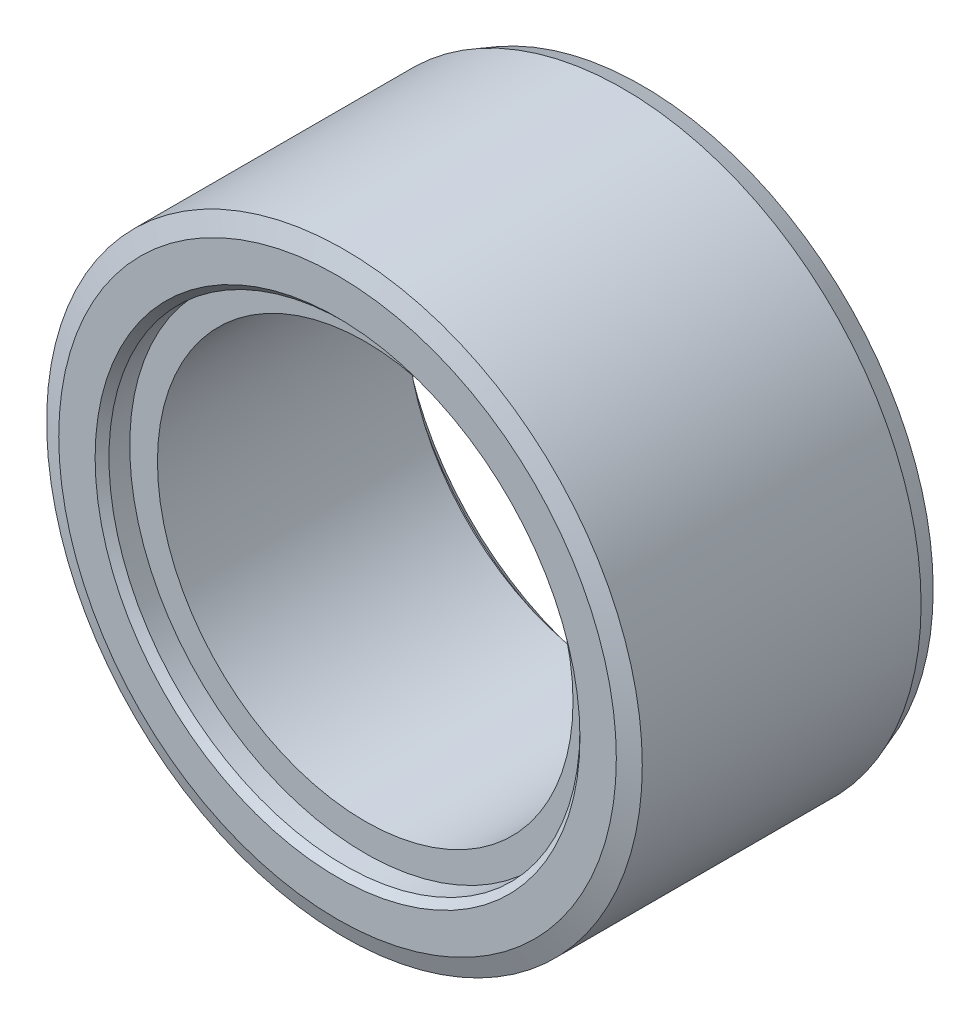
ISO-10303-21;
HEADER;
FILE_DESCRIPTION(('STEP AP214'),'2;1');
FILE_NAME('part.step','',(''),(''),'','','');
FILE_SCHEMA(('AUTOMOTIVE_DESIGN { 1 0 10303 214 1 1 1 1 }'));
ENDSEC;
DATA;
#1=APPLICATION_CONTEXT('core data for automotive mechanical design processes');
#2=APPLICATION_PROTOCOL_DEFINITION('international standard','automotive_design',2000,#1);
#3=PRODUCT_CONTEXT('',#1,'mechanical');
#4=PRODUCT('Part','Part','',(#3));
#5=PRODUCT_RELATED_PRODUCT_CATEGORY('part','',(#4));
#6=PRODUCT_DEFINITION_FORMATION('','',#4);
#7=PRODUCT_DEFINITION_CONTEXT('part definition',#1,'design');
#8=PRODUCT_DEFINITION('design','',#6,#7);
#9=PRODUCT_DEFINITION_SHAPE('','',#8);
#10=(LENGTH_UNIT() NAMED_UNIT(*) SI_UNIT(.MILLI.,.METRE.));
#11=(NAMED_UNIT(*) PLANE_ANGLE_UNIT() SI_UNIT($,.RADIAN.));
#12=(NAMED_UNIT(*) SI_UNIT($,.STERADIAN.) SOLID_ANGLE_UNIT());
#13=UNCERTAINTY_MEASURE_WITH_UNIT(LENGTH_MEASURE(1.E-05),#10,'distance_accuracy_value','');
#14=(GEOMETRIC_REPRESENTATION_CONTEXT(3) GLOBAL_UNCERTAINTY_ASSIGNED_CONTEXT((#13)) GLOBAL_UNIT_ASSIGNED_CONTEXT((#10,
#11,#12)) REPRESENTATION_CONTEXT('',''));
#15=CARTESIAN_POINT('',(0.,0.,0.));
#16=DIRECTION('',(0.,0.,1.));
#17=DIRECTION('',(1.,0.,0.));
#18=AXIS2_PLACEMENT_3D('',#15,#16,#17);
#19=CARTESIAN_POINT('',(0.,0.,-42.4264068711929));
#20=DIRECTION('',(0.,0.,1.));
#21=DIRECTION('',(1.,0.,0.));
#22=AXIS2_PLACEMENT_3D('',#19,#20,#21);
#23=CYLINDRICAL_SURFACE('',#22,15.);
#24=CARTESIAN_POINT('',(0.,0.,20.));
#25=DIRECTION('',(0.,0.,1.));
#26=DIRECTION('',(1.,0.,0.));
#27=AXIS2_PLACEMENT_3D('',#24,#25,#26);
#28=CIRCLE('',#27,15.);
#29=CARTESIAN_POINT('',(15.,0.,20.));
#30=VERTEX_POINT('',#29);
#31=EDGE_CURVE('E86',#30,#30,#28,.F.);
#32=ORIENTED_EDGE('',*,*,#31,.F.);
#33=EDGE_LOOP('',(#32));
#34=FACE_BOUND('',#33,.T.);
#35=CARTESIAN_POINT('',(0.,0.,2.));
#36=DIRECTION('',(0.,0.,-1.));
#37=DIRECTION('',(-1.,0.,0.));
#38=AXIS2_PLACEMENT_3D('',#35,#36,#37);
#39=CIRCLE('',#38,15.);
#40=CARTESIAN_POINT('',(-15.,0.,2.));
#41=VERTEX_POINT('',#40);
#42=EDGE_CURVE('E87',#41,#41,#39,.F.);
#43=ORIENTED_EDGE('',*,*,#42,.F.);
#44=EDGE_LOOP('',(#43));
#45=FACE_BOUND('',#44,.T.);
#46=ADVANCED_FACE('F45',(#34,#45),#23,.F.);
#47=CARTESIAN_POINT('',(0.,0.,22.));
#48=DIRECTION('',(0.,0.,-1.));
#49=DIRECTION('',(-1.,0.,0.));
#50=AXIS2_PLACEMENT_3D('',#47,#48,#49);
#51=CYLINDRICAL_SURFACE('',#50,21.5);
#52=CARTESIAN_POINT('',(0.,0.,21.5));
#53=DIRECTION('',(0.,0.,1.));
#54=DIRECTION('',(1.,0.,0.));
#55=AXIS2_PLACEMENT_3D('',#52,#53,#54);
#56=CIRCLE('',#55,21.5);
#57=CARTESIAN_POINT('',(21.5,0.,21.5));
#58=VERTEX_POINT('',#57);
#59=EDGE_CURVE('E11',#58,#58,#56,.F.);
#60=ORIENTED_EDGE('',*,*,#59,.T.);
#61=EDGE_LOOP('',(#60));
#62=FACE_BOUND('',#61,.T.);
#63=CARTESIAN_POINT('',(0.,0.,1.3737387097273));
#64=DIRECTION('',(0.,0.,1.));
#65=DIRECTION('',(1.,0.,0.));
#66=AXIS2_PLACEMENT_3D('',#63,#64,#65);
#67=CIRCLE('',#66,21.5);
#68=CARTESIAN_POINT('',(21.5,0.,1.3737387097273));
#69=VERTEX_POINT('',#68);
#70=EDGE_CURVE('E64',#69,#69,#67,.T.);
#71=ORIENTED_EDGE('',*,*,#70,.T.);
#72=EDGE_LOOP('',(#71));
#73=FACE_BOUND('',#72,.T.);
#74=ADVANCED_FACE('F124',(#62,#73),#51,.T.);
#75=CARTESIAN_POINT('',(0.,0.,22.));
#76=DIRECTION('',(0.,0.,1.));
#77=DIRECTION('',(1.,0.,0.));
#78=AXIS2_PLACEMENT_3D('',#75,#76,#77);
#79=PLANE('',#78);
#80=CARTESIAN_POINT('',(0.,0.,22.));
#81=DIRECTION('',(0.,0.,1.));
#82=DIRECTION('',(1.,0.,0.));
#83=AXIS2_PLACEMENT_3D('',#80,#81,#82);
#84=CIRCLE('',#83,20.1262612902727);
#85=CARTESIAN_POINT('',(20.1262612902727,0.,22.));
#86=VERTEX_POINT('',#85);
#87=EDGE_CURVE('E54',#86,#86,#84,.T.);
#88=ORIENTED_EDGE('',*,*,#87,.T.);
#89=EDGE_LOOP('',(#88));
#90=FACE_BOUND('',#89,.T.);
#91=CARTESIAN_POINT('',(0.,0.,22.));
#92=DIRECTION('',(0.,0.,1.));
#93=DIRECTION('',(1.,0.,0.));
#94=AXIS2_PLACEMENT_3D('',#91,#92,#93);
#95=CIRCLE('',#94,17.5);
#96=CARTESIAN_POINT('',(17.5,0.,22.));
#97=VERTEX_POINT('',#96);
#98=EDGE_CURVE('E78',#97,#97,#95,.F.);
#99=ORIENTED_EDGE('',*,*,#98,.T.);
#100=EDGE_LOOP('',(#99));
#101=FACE_BOUND('',#100,.T.);
#102=ADVANCED_FACE('F131',(#90,#101),#79,.T.);
#103=CARTESIAN_POINT('',(0.,0.,0.));
#104=DIRECTION('',(0.,0.,1.));
#105=DIRECTION('',(1.,0.,0.));
#106=AXIS2_PLACEMENT_3D('',#103,#104,#105);
#107=PLANE('',#106);
#108=CARTESIAN_POINT('',(0.,0.,0.));
#109=DIRECTION('',(0.,0.,1.));
#110=DIRECTION('',(1.,0.,0.));
#111=AXIS2_PLACEMENT_3D('',#108,#109,#110);
#112=CIRCLE('',#111,21.);
#113=CARTESIAN_POINT('',(21.,0.,0.));
#114=VERTEX_POINT('',#113);
#115=EDGE_CURVE('E59',#114,#114,#112,.F.);
#116=ORIENTED_EDGE('',*,*,#115,.T.);
#117=EDGE_LOOP('',(#116));
#118=FACE_BOUND('',#117,.T.);
#119=CARTESIAN_POINT('',(0.,0.,0.));
#120=DIRECTION('',(0.,0.,1.));
#121=DIRECTION('',(1.,0.,0.));
#122=AXIS2_PLACEMENT_3D('',#119,#120,#121);
#123=CIRCLE('',#122,17.5);
#124=CARTESIAN_POINT('',(17.5,0.,0.));
#125=VERTEX_POINT('',#124);
#126=EDGE_CURVE('E70',#125,#125,#123,.T.);
#127=ORIENTED_EDGE('',*,*,#126,.T.);
#128=EDGE_LOOP('',(#127));
#129=FACE_BOUND('',#128,.T.);
#130=ADVANCED_FACE('F139',(#118,#129),#107,.F.);
#131=CARTESIAN_POINT('',(0.,0.,20.));
#132=DIRECTION('',(0.,0.,1.));
#133=DIRECTION('',(1.,0.,0.));
#134=AXIS2_PLACEMENT_3D('',#131,#132,#133);
#135=PLANE('',#134);
#136=CARTESIAN_POINT('',(0.,0.,20.));
#137=DIRECTION('',(0.,0.,1.));
#138=DIRECTION('',(1.,0.,0.));
#139=AXIS2_PLACEMENT_3D('',#136,#137,#138);
#140=CIRCLE('',#139,17.);
#141=CARTESIAN_POINT('',(17.,0.,20.));
#142=VERTEX_POINT('',#141);
#143=EDGE_CURVE('E91',#142,#142,#140,.T.);
#144=ORIENTED_EDGE('',*,*,#143,.T.);
#145=EDGE_LOOP('',(#144));
#146=FACE_BOUND('',#145,.T.);
#147=ORIENTED_EDGE('',*,*,#31,.T.);
#148=EDGE_LOOP('',(#147));
#149=FACE_BOUND('',#148,.T.);
#150=ADVANCED_FACE('F141',(#146,#149),#135,.T.);
#151=CARTESIAN_POINT('',(0.,0.,20.));
#152=DIRECTION('',(0.,0.,1.));
#153=DIRECTION('',(1.,0.,0.));
#154=AXIS2_PLACEMENT_3D('',#151,#152,#153);
#155=CYLINDRICAL_SURFACE('',#154,17.);
#156=CARTESIAN_POINT('',(0.,0.,21.5));
#157=DIRECTION('',(0.,0.,1.));
#158=DIRECTION('',(1.,0.,0.));
#159=AXIS2_PLACEMENT_3D('',#156,#157,#158);
#160=CIRCLE('',#159,17.);
#161=CARTESIAN_POINT('',(17.,0.,21.5));
#162=VERTEX_POINT('',#161);
#163=EDGE_CURVE('E82',#162,#162,#160,.T.);
#164=ORIENTED_EDGE('',*,*,#163,.T.);
#165=EDGE_LOOP('',(#164));
#166=FACE_BOUND('',#165,.T.);
#167=ORIENTED_EDGE('',*,*,#143,.F.);
#168=EDGE_LOOP('',(#167));
#169=FACE_BOUND('',#168,.T.);
#170=ADVANCED_FACE('F120',(#166,#169),#155,.F.);
#171=CARTESIAN_POINT('',(0.,0.,2.));
#172=DIRECTION('',(0.,0.,-1.));
#173=DIRECTION('',(-1.,0.,0.));
#174=AXIS2_PLACEMENT_3D('',#171,#172,#173);
#175=PLANE('',#174);
#176=CARTESIAN_POINT('',(0.,0.,2.));
#177=DIRECTION('',(0.,0.,-1.));
#178=DIRECTION('',(-1.,0.,0.));
#179=AXIS2_PLACEMENT_3D('',#176,#177,#178);
#180=CIRCLE('',#179,17.);
#181=CARTESIAN_POINT('',(-17.,0.,2.));
#182=VERTEX_POINT('',#181);
#183=EDGE_CURVE('E92',#182,#182,#180,.T.);
#184=ORIENTED_EDGE('',*,*,#183,.T.);
#185=EDGE_LOOP('',(#184));
#186=FACE_BOUND('',#185,.T.);
#187=ORIENTED_EDGE('',*,*,#42,.T.);
#188=EDGE_LOOP('',(#187));
#189=FACE_BOUND('',#188,.T.);
#190=ADVANCED_FACE('F103',(#186,#189),#175,.T.);
#191=CARTESIAN_POINT('',(0.,0.,2.));
#192=DIRECTION('',(0.,0.,-1.));
#193=DIRECTION('',(-1.,0.,0.));
#194=AXIS2_PLACEMENT_3D('',#191,#192,#193);
#195=CYLINDRICAL_SURFACE('',#194,17.);
#196=CARTESIAN_POINT('',(0.,0.,0.49999999999999));
#197=DIRECTION('',(0.,0.,1.));
#198=DIRECTION('',(1.,0.,0.));
#199=AXIS2_PLACEMENT_3D('',#196,#197,#198);
#200=CIRCLE('',#199,17.);
#201=CARTESIAN_POINT('',(17.,0.,0.49999999999999));
#202=VERTEX_POINT('',#201);
#203=EDGE_CURVE('E74',#202,#202,#200,.F.);
#204=ORIENTED_EDGE('',*,*,#203,.T.);
#205=EDGE_LOOP('',(#204));
#206=FACE_BOUND('',#205,.T.);
#207=ORIENTED_EDGE('',*,*,#183,.F.);
#208=EDGE_LOOP('',(#207));
#209=FACE_BOUND('',#208,.T.);
#210=ADVANCED_FACE('F106',(#206,#209),#195,.F.);
#211=CARTESIAN_POINT('',(0.,0.,21.5));
#212=DIRECTION('',(0.,0.,1.));
#213=DIRECTION('',(1.,0.,0.));
#214=AXIS2_PLACEMENT_3D('',#211,#212,#213);
#215=CONICAL_SURFACE('',#214,17.,0.785398163397445);
#216=ORIENTED_EDGE('',*,*,#98,.F.);
#217=EDGE_LOOP('',(#216));
#218=FACE_BOUND('',#217,.T.);
#219=ORIENTED_EDGE('',*,*,#163,.F.);
#220=EDGE_LOOP('',(#219));
#221=FACE_BOUND('',#220,.T.);
#222=ADVANCED_FACE('F108',(#218,#221),#215,.F.);
#223=CARTESIAN_POINT('',(0.,0.,0.49999999999999));
#224=DIRECTION('',(0.,0.,-1.));
#225=DIRECTION('',(-1.,0.,0.));
#226=AXIS2_PLACEMENT_3D('',#223,#224,#225);
#227=CONICAL_SURFACE('',#226,17.,0.785398163397452);
#228=ORIENTED_EDGE('',*,*,#126,.F.);
#229=EDGE_LOOP('',(#228));
#230=FACE_BOUND('',#229,.T.);
#231=ORIENTED_EDGE('',*,*,#203,.F.);
#232=EDGE_LOOP('',(#231));
#233=FACE_BOUND('',#232,.T.);
#234=ADVANCED_FACE('F116',(#230,#233),#227,.F.);
#235=CARTESIAN_POINT('',(0.,0.,1.3737387097273));
#236=DIRECTION('',(0.,0.,1.));
#237=DIRECTION('',(1.,0.,0.));
#238=AXIS2_PLACEMENT_3D('',#235,#236,#237);
#239=CONICAL_SURFACE('',#238,21.5,0.349065850398867);
#240=ORIENTED_EDGE('',*,*,#115,.F.);
#241=EDGE_LOOP('',(#240));
#242=FACE_BOUND('',#241,.T.);
#243=ORIENTED_EDGE('',*,*,#70,.F.);
#244=EDGE_LOOP('',(#243));
#245=FACE_BOUND('',#244,.T.);
#246=ADVANCED_FACE('F152',(#242,#245),#239,.T.);
#247=CARTESIAN_POINT('',(0.,0.,22.));
#248=DIRECTION('',(0.,0.,-1.));
#249=DIRECTION('',(-1.,0.,0.));
#250=AXIS2_PLACEMENT_3D('',#247,#248,#249);
#251=CONICAL_SURFACE('',#250,20.1262612902727,1.22173047639603);
#252=ORIENTED_EDGE('',*,*,#59,.F.);
#253=EDGE_LOOP('',(#252));
#254=FACE_BOUND('',#253,.T.);
#255=ORIENTED_EDGE('',*,*,#87,.F.);
#256=EDGE_LOOP('',(#255));
#257=FACE_BOUND('',#256,.T.);
#258=ADVANCED_FACE('F48',(#254,#257),#251,.T.);
#259=CLOSED_SHELL('',(#46,#74,#102,#130,#150,#170,#190,#210,#222,#234,#246,#258));
#260=MANIFOLD_SOLID_BREP('B2',#259);
#261=ADVANCED_BREP_SHAPE_REPRESENTATION('',(#18,#260),#14);
#262=SHAPE_DEFINITION_REPRESENTATION(#9,#261);
ENDSEC;
END-ISO-10303-21;
